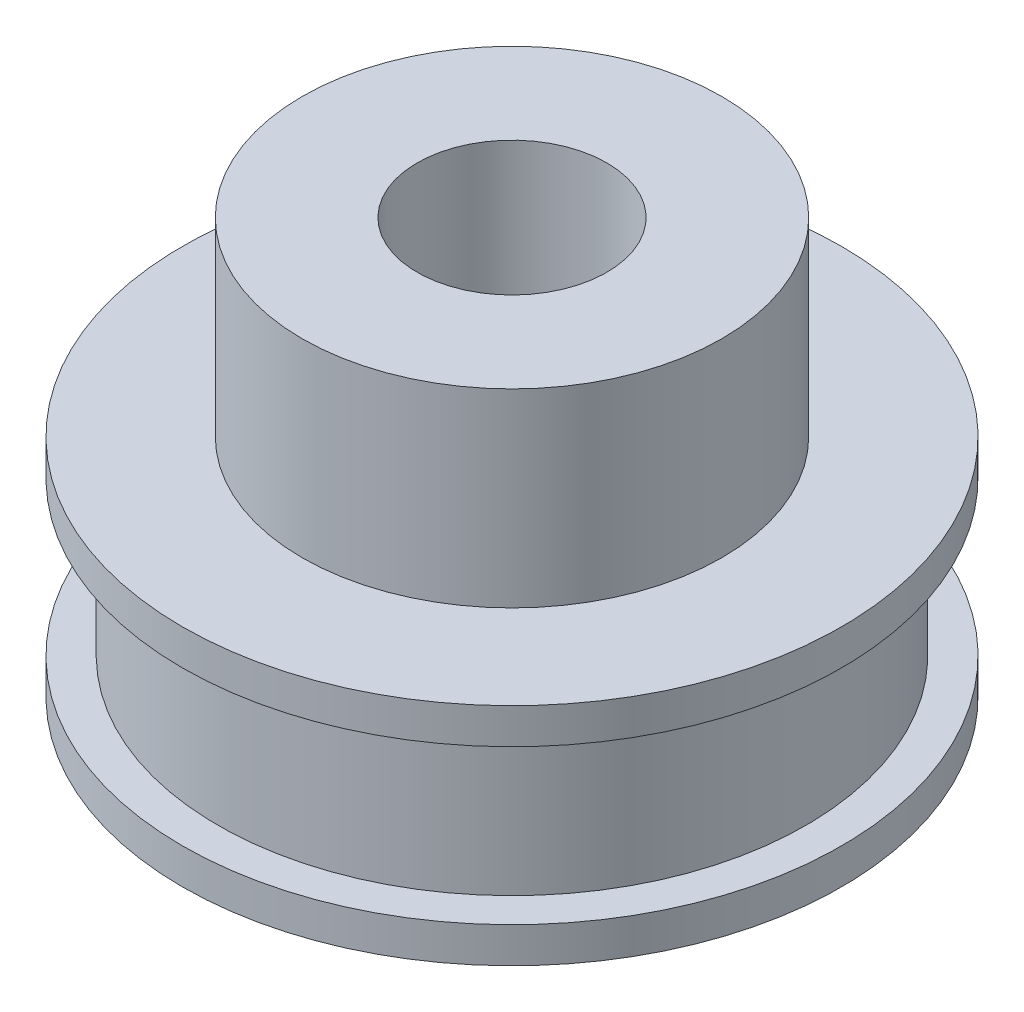
ISO-10303-21;
HEADER;
FILE_DESCRIPTION(('STEP AP214'),'2;1');
FILE_NAME('part.step','',(''),(''),'','','');
FILE_SCHEMA(('AUTOMOTIVE_DESIGN { 1 0 10303 214 1 1 1 1 }'));
ENDSEC;
DATA;
#1=APPLICATION_CONTEXT('core data for automotive mechanical design processes');
#2=APPLICATION_PROTOCOL_DEFINITION('international standard','automotive_design',2000,#1);
#3=PRODUCT_CONTEXT('',#1,'mechanical');
#4=PRODUCT('Part','Part','',(#3));
#5=PRODUCT_RELATED_PRODUCT_CATEGORY('part','',(#4));
#6=PRODUCT_DEFINITION_FORMATION('','',#4);
#7=PRODUCT_DEFINITION_CONTEXT('part definition',#1,'design');
#8=PRODUCT_DEFINITION('design','',#6,#7);
#9=PRODUCT_DEFINITION_SHAPE('','',#8);
#10=(LENGTH_UNIT() NAMED_UNIT(*) SI_UNIT(.MILLI.,.METRE.));
#11=(NAMED_UNIT(*) PLANE_ANGLE_UNIT() SI_UNIT($,.RADIAN.));
#12=(NAMED_UNIT(*) SI_UNIT($,.STERADIAN.) SOLID_ANGLE_UNIT());
#13=UNCERTAINTY_MEASURE_WITH_UNIT(LENGTH_MEASURE(1.E-05),#10,'distance_accuracy_value','');
#14=(GEOMETRIC_REPRESENTATION_CONTEXT(3) GLOBAL_UNCERTAINTY_ASSIGNED_CONTEXT((#13)) GLOBAL_UNIT_ASSIGNED_CONTEXT((#10,
#11,#12)) REPRESENTATION_CONTEXT('',''));
#15=CARTESIAN_POINT('',(0.,0.,0.));
#16=DIRECTION('',(0.,0.,1.));
#17=DIRECTION('',(1.,0.,0.));
#18=AXIS2_PLACEMENT_3D('',#15,#16,#17);
#19=CARTESIAN_POINT('',(0.,0.,0.));
#20=DIRECTION('',(0.,-1.,0.));
#21=DIRECTION('',(0.,0.,-1.));
#22=AXIS2_PLACEMENT_3D('',#19,#20,#21);
#23=CYLINDRICAL_SURFACE('',#22,4.);
#24=CARTESIAN_POINT('',(0.,0.,0.));
#25=DIRECTION('',(0.,-1.,0.));
#26=DIRECTION('',(0.,0.,-1.));
#27=AXIS2_PLACEMENT_3D('',#24,#25,#26);
#28=CIRCLE('',#27,4.);
#29=CARTESIAN_POINT('',(0.,0.,-4.));
#30=VERTEX_POINT('',#29);
#31=EDGE_CURVE('E10',#30,#30,#28,.T.);
#32=ORIENTED_EDGE('',*,*,#31,.T.);
#33=EDGE_LOOP('',(#32));
#34=FACE_BOUND('',#33,.T.);
#35=CARTESIAN_POINT('',(0.,17.5,0.));
#36=DIRECTION('',(0.,-1.,0.));
#37=DIRECTION('',(0.,0.,-1.));
#38=AXIS2_PLACEMENT_3D('',#35,#36,#37);
#39=CIRCLE('',#38,4.);
#40=CARTESIAN_POINT('',(0.,17.5,-4.));
#41=VERTEX_POINT('',#40);
#42=EDGE_CURVE('E65',#41,#41,#39,.T.);
#43=ORIENTED_EDGE('',*,*,#42,.F.);
#44=EDGE_LOOP('',(#43));
#45=FACE_BOUND('',#44,.T.);
#46=ADVANCED_FACE('F31',(#34,#45),#23,.F.);
#47=CARTESIAN_POINT('',(4.,0.,0.));
#48=DIRECTION('',(0.,-1.,0.));
#49=DIRECTION('',(0.,0.,-1.));
#50=AXIS2_PLACEMENT_3D('',#47,#48,#49);
#51=PLANE('',#50);
#52=CARTESIAN_POINT('',(0.,0.,0.));
#53=DIRECTION('',(0.,-1.,0.));
#54=DIRECTION('',(0.,0.,-1.));
#55=AXIS2_PLACEMENT_3D('',#52,#53,#54);
#56=CIRCLE('',#55,13.9);
#57=CARTESIAN_POINT('',(0.,0.,-13.9));
#58=VERTEX_POINT('',#57);
#59=EDGE_CURVE('E37',#58,#58,#56,.T.);
#60=ORIENTED_EDGE('',*,*,#59,.T.);
#61=EDGE_LOOP('',(#60));
#62=FACE_BOUND('',#61,.T.);
#63=ORIENTED_EDGE('',*,*,#31,.F.);
#64=EDGE_LOOP('',(#63));
#65=FACE_BOUND('',#64,.T.);
#66=ADVANCED_FACE('F73',(#62,#65),#51,.T.);
#67=CARTESIAN_POINT('',(0.,0.,0.));
#68=DIRECTION('',(0.,-1.,0.));
#69=DIRECTION('',(0.,0.,-1.));
#70=AXIS2_PLACEMENT_3D('',#67,#68,#69);
#71=CYLINDRICAL_SURFACE('',#70,13.9);
#72=CARTESIAN_POINT('',(0.,1.5,0.));
#73=DIRECTION('',(0.,-1.,0.));
#74=DIRECTION('',(0.,0.,-1.));
#75=AXIS2_PLACEMENT_3D('',#72,#73,#74);
#76=CIRCLE('',#75,13.9);
#77=CARTESIAN_POINT('',(0.,1.5,-13.9));
#78=VERTEX_POINT('',#77);
#79=EDGE_CURVE('E41',#78,#78,#76,.T.);
#80=ORIENTED_EDGE('',*,*,#79,.T.);
#81=EDGE_LOOP('',(#80));
#82=FACE_BOUND('',#81,.T.);
#83=ORIENTED_EDGE('',*,*,#59,.F.);
#84=EDGE_LOOP('',(#83));
#85=FACE_BOUND('',#84,.T.);
#86=ADVANCED_FACE('F77',(#82,#85),#71,.T.);
#87=CARTESIAN_POINT('',(13.9,1.5,0.));
#88=DIRECTION('',(0.,1.,0.));
#89=DIRECTION('',(0.,0.,1.));
#90=AXIS2_PLACEMENT_3D('',#87,#88,#89);
#91=PLANE('',#90);
#92=CARTESIAN_POINT('',(0.,1.5,0.));
#93=DIRECTION('',(0.,-1.,0.));
#94=DIRECTION('',(0.,0.,-1.));
#95=AXIS2_PLACEMENT_3D('',#92,#93,#94);
#96=CIRCLE('',#95,12.4);
#97=CARTESIAN_POINT('',(0.,1.5,-12.4));
#98=VERTEX_POINT('',#97);
#99=EDGE_CURVE('E45',#98,#98,#96,.T.);
#100=ORIENTED_EDGE('',*,*,#99,.T.);
#101=EDGE_LOOP('',(#100));
#102=FACE_BOUND('',#101,.T.);
#103=ORIENTED_EDGE('',*,*,#79,.F.);
#104=EDGE_LOOP('',(#103));
#105=FACE_BOUND('',#104,.T.);
#106=ADVANCED_FACE('F81',(#102,#105),#91,.T.);
#107=CARTESIAN_POINT('',(0.,0.,0.));
#108=DIRECTION('',(0.,-1.,0.));
#109=DIRECTION('',(0.,0.,-1.));
#110=AXIS2_PLACEMENT_3D('',#107,#108,#109);
#111=CYLINDRICAL_SURFACE('',#110,12.4);
#112=CARTESIAN_POINT('',(0.,8.,0.));
#113=DIRECTION('',(0.,-1.,0.));
#114=DIRECTION('',(0.,0.,-1.));
#115=AXIS2_PLACEMENT_3D('',#112,#113,#114);
#116=CIRCLE('',#115,12.4);
#117=CARTESIAN_POINT('',(0.,8.,-12.4));
#118=VERTEX_POINT('',#117);
#119=EDGE_CURVE('E50',#118,#118,#116,.T.);
#120=ORIENTED_EDGE('',*,*,#119,.T.);
#121=EDGE_LOOP('',(#120));
#122=FACE_BOUND('',#121,.T.);
#123=ORIENTED_EDGE('',*,*,#99,.F.);
#124=EDGE_LOOP('',(#123));
#125=FACE_BOUND('',#124,.T.);
#126=ADVANCED_FACE('F88',(#122,#125),#111,.T.);
#127=CARTESIAN_POINT('',(12.4,8.,0.));
#128=DIRECTION('',(0.,-1.,0.));
#129=DIRECTION('',(0.,0.,-1.));
#130=AXIS2_PLACEMENT_3D('',#127,#128,#129);
#131=PLANE('',#130);
#132=CARTESIAN_POINT('',(0.,8.,0.));
#133=DIRECTION('',(0.,-1.,0.));
#134=DIRECTION('',(0.,0.,-1.));
#135=AXIS2_PLACEMENT_3D('',#132,#133,#134);
#136=CIRCLE('',#135,13.9);
#137=CARTESIAN_POINT('',(0.,8.,-13.9));
#138=VERTEX_POINT('',#137);
#139=EDGE_CURVE('E53',#138,#138,#136,.T.);
#140=ORIENTED_EDGE('',*,*,#139,.T.);
#141=EDGE_LOOP('',(#140));
#142=FACE_BOUND('',#141,.T.);
#143=ORIENTED_EDGE('',*,*,#119,.F.);
#144=EDGE_LOOP('',(#143));
#145=FACE_BOUND('',#144,.T.);
#146=ADVANCED_FACE('F92',(#142,#145),#131,.T.);
#147=CARTESIAN_POINT('',(0.,0.,0.));
#148=DIRECTION('',(0.,-1.,0.));
#149=DIRECTION('',(0.,0.,-1.));
#150=AXIS2_PLACEMENT_3D('',#147,#148,#149);
#151=CYLINDRICAL_SURFACE('',#150,13.9);
#152=CARTESIAN_POINT('',(0.,9.5,0.));
#153=DIRECTION('',(0.,-1.,0.));
#154=DIRECTION('',(0.,0.,-1.));
#155=AXIS2_PLACEMENT_3D('',#152,#153,#154);
#156=CIRCLE('',#155,13.9);
#157=CARTESIAN_POINT('',(0.,9.5,-13.9));
#158=VERTEX_POINT('',#157);
#159=EDGE_CURVE('E56',#158,#158,#156,.T.);
#160=ORIENTED_EDGE('',*,*,#159,.T.);
#161=EDGE_LOOP('',(#160));
#162=FACE_BOUND('',#161,.T.);
#163=ORIENTED_EDGE('',*,*,#139,.F.);
#164=EDGE_LOOP('',(#163));
#165=FACE_BOUND('',#164,.T.);
#166=ADVANCED_FACE('F96',(#162,#165),#151,.T.);
#167=CARTESIAN_POINT('',(13.9,9.5,0.));
#168=DIRECTION('',(0.,1.,0.));
#169=DIRECTION('',(0.,0.,1.));
#170=AXIS2_PLACEMENT_3D('',#167,#168,#169);
#171=PLANE('',#170);
#172=CARTESIAN_POINT('',(0.,9.5,0.));
#173=DIRECTION('',(0.,-1.,0.));
#174=DIRECTION('',(0.,0.,-1.));
#175=AXIS2_PLACEMENT_3D('',#172,#173,#174);
#176=CIRCLE('',#175,8.85);
#177=CARTESIAN_POINT('',(0.,9.5,-8.85));
#178=VERTEX_POINT('',#177);
#179=EDGE_CURVE('E59',#178,#178,#176,.T.);
#180=ORIENTED_EDGE('',*,*,#179,.T.);
#181=EDGE_LOOP('',(#180));
#182=FACE_BOUND('',#181,.T.);
#183=ORIENTED_EDGE('',*,*,#159,.F.);
#184=EDGE_LOOP('',(#183));
#185=FACE_BOUND('',#184,.T.);
#186=ADVANCED_FACE('F100',(#182,#185),#171,.T.);
#187=CARTESIAN_POINT('',(0.,0.,0.));
#188=DIRECTION('',(0.,-1.,0.));
#189=DIRECTION('',(0.,0.,-1.));
#190=AXIS2_PLACEMENT_3D('',#187,#188,#189);
#191=CYLINDRICAL_SURFACE('',#190,8.85);
#192=CARTESIAN_POINT('',(0.,17.5,0.));
#193=DIRECTION('',(0.,-1.,0.));
#194=DIRECTION('',(0.,0.,-1.));
#195=AXIS2_PLACEMENT_3D('',#192,#193,#194);
#196=CIRCLE('',#195,8.85);
#197=CARTESIAN_POINT('',(0.,17.5,-8.85));
#198=VERTEX_POINT('',#197);
#199=EDGE_CURVE('E62',#198,#198,#196,.T.);
#200=ORIENTED_EDGE('',*,*,#199,.T.);
#201=EDGE_LOOP('',(#200));
#202=FACE_BOUND('',#201,.T.);
#203=ORIENTED_EDGE('',*,*,#179,.F.);
#204=EDGE_LOOP('',(#203));
#205=FACE_BOUND('',#204,.T.);
#206=ADVANCED_FACE('F104',(#202,#205),#191,.T.);
#207=CARTESIAN_POINT('',(8.85,17.5,0.));
#208=DIRECTION('',(0.,1.,0.));
#209=DIRECTION('',(0.,0.,1.));
#210=AXIS2_PLACEMENT_3D('',#207,#208,#209);
#211=PLANE('',#210);
#212=ORIENTED_EDGE('',*,*,#42,.T.);
#213=EDGE_LOOP('',(#212));
#214=FACE_BOUND('',#213,.T.);
#215=ORIENTED_EDGE('',*,*,#199,.F.);
#216=EDGE_LOOP('',(#215));
#217=FACE_BOUND('',#216,.T.);
#218=ADVANCED_FACE('F69',(#214,#217),#211,.T.);
#219=CLOSED_SHELL('',(#46,#66,#86,#106,#126,#146,#166,#186,#206,#218));
#220=MANIFOLD_SOLID_BREP('B2',#219);
#221=ADVANCED_BREP_SHAPE_REPRESENTATION('',(#18,#220),#14);
#222=SHAPE_DEFINITION_REPRESENTATION(#9,#221);
ENDSEC;
END-ISO-10303-21;
